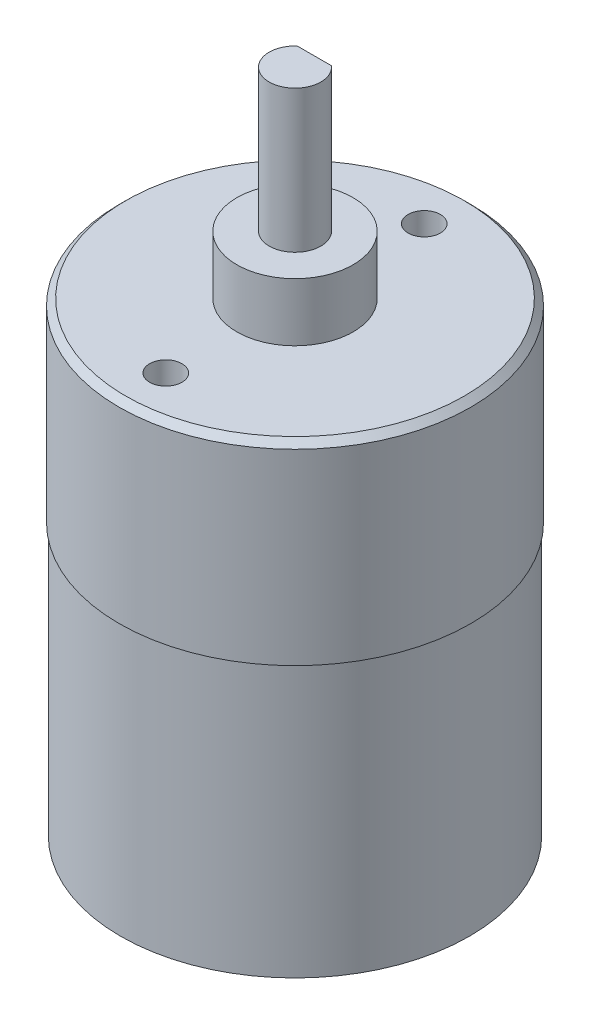
ISO-10303-21;
HEADER;
FILE_DESCRIPTION(('STEP AP214'),'2;1');
FILE_NAME('part.step','',(''),(''),'','','');
FILE_SCHEMA(('AUTOMOTIVE_DESIGN { 1 0 10303 214 1 1 1 1 }'));
ENDSEC;
DATA;
#1=APPLICATION_CONTEXT('core data for automotive mechanical design processes');
#2=APPLICATION_PROTOCOL_DEFINITION('international standard','automotive_design',2000,#1);
#3=PRODUCT_CONTEXT('',#1,'mechanical');
#4=PRODUCT('Part','Part','',(#3));
#5=PRODUCT_RELATED_PRODUCT_CATEGORY('part','',(#4));
#6=PRODUCT_DEFINITION_FORMATION('','',#4);
#7=PRODUCT_DEFINITION_CONTEXT('part definition',#1,'design');
#8=PRODUCT_DEFINITION('design','',#6,#7);
#9=PRODUCT_DEFINITION_SHAPE('','',#8);
#10=(LENGTH_UNIT() NAMED_UNIT(*) SI_UNIT(.MILLI.,.METRE.));
#11=(NAMED_UNIT(*) PLANE_ANGLE_UNIT() SI_UNIT($,.RADIAN.));
#12=(NAMED_UNIT(*) SI_UNIT($,.STERADIAN.) SOLID_ANGLE_UNIT());
#13=UNCERTAINTY_MEASURE_WITH_UNIT(LENGTH_MEASURE(1.E-05),#10,'distance_accuracy_value','');
#14=(GEOMETRIC_REPRESENTATION_CONTEXT(3) GLOBAL_UNCERTAINTY_ASSIGNED_CONTEXT((#13)) GLOBAL_UNIT_ASSIGNED_CONTEXT((#10,
#11,#12)) REPRESENTATION_CONTEXT('',''));
#15=CARTESIAN_POINT('',(0.,0.,0.));
#16=DIRECTION('',(0.,0.,1.));
#17=DIRECTION('',(1.,0.,0.));
#18=AXIS2_PLACEMENT_3D('',#15,#16,#17);
#19=CARTESIAN_POINT('',(0.,52.5,0.));
#20=DIRECTION('',(0.,1.,0.));
#21=DIRECTION('',(-1.,0.,0.));
#22=AXIS2_PLACEMENT_3D('',#19,#20,#21);
#23=CYLINDRICAL_SURFACE('',#22,4.25000000000001);
#24=CARTESIAN_POINT('',(0.,1.,0.));
#25=DIRECTION('',(0.,1.,0.));
#26=DIRECTION('',(-1.,0.,0.));
#27=AXIS2_PLACEMENT_3D('',#24,#25,#26);
#28=CIRCLE('',#27,4.25000000000001);
#29=CARTESIAN_POINT('',(-4.25000000000001,1.,0.));
#30=VERTEX_POINT('',#29);
#31=EDGE_CURVE('E178',#30,#30,#28,.T.);
#32=ORIENTED_EDGE('',*,*,#31,.F.);
#33=EDGE_LOOP('',(#32));
#34=FACE_BOUND('',#33,.T.);
#35=CARTESIAN_POINT('',(0.,0.,0.));
#36=DIRECTION('',(0.,1.,0.));
#37=DIRECTION('',(-1.,0.,0.));
#38=AXIS2_PLACEMENT_3D('',#35,#36,#37);
#39=CIRCLE('',#38,4.25000000000001);
#40=CARTESIAN_POINT('',(-4.25000000000001,0.,0.));
#41=VERTEX_POINT('',#40);
#42=EDGE_CURVE('E78',#41,#41,#39,.T.);
#43=ORIENTED_EDGE('',*,*,#42,.T.);
#44=EDGE_LOOP('',(#43));
#45=FACE_BOUND('',#44,.T.);
#46=ADVANCED_FACE('F35',(#34,#45),#23,.T.);
#47=CARTESIAN_POINT('',(4.25000000000001,0.,0.));
#48=DIRECTION('',(0.,1.,0.));
#49=DIRECTION('',(-1.,0.,0.));
#50=AXIS2_PLACEMENT_3D('',#47,#48,#49);
#51=PLANE('',#50);
#52=ORIENTED_EDGE('',*,*,#42,.F.);
#53=EDGE_LOOP('',(#52));
#54=FACE_BOUND('',#53,.T.);
#55=ADVANCED_FACE('F104',(#54),#51,.F.);
#56=CARTESIAN_POINT('',(2.,52.5,0.));
#57=DIRECTION('',(0.,-1.,0.));
#58=DIRECTION('',(1.,0.,0.));
#59=AXIS2_PLACEMENT_3D('',#56,#57,#58);
#60=PLANE('',#59);
#61=CARTESIAN_POINT('',(0.,52.5,0.));
#62=DIRECTION('',(0.,1.,0.));
#63=DIRECTION('',(-1.,0.,0.));
#64=AXIS2_PLACEMENT_3D('',#61,#62,#63);
#65=CIRCLE('',#64,2.);
#66=CARTESIAN_POINT('',(-1.3228756555323,52.5,-1.5));
#67=VERTEX_POINT('',#66);
#68=CARTESIAN_POINT('',(1.3228756555323,52.5,-1.5));
#69=VERTEX_POINT('',#68);
#70=EDGE_CURVE('E73',#67,#69,#65,.T.);
#71=ORIENTED_EDGE('',*,*,#70,.T.);
#72=DIRECTION('',(1.,0.,0.));
#73=VECTOR('',#72,1.);
#74=CARTESIAN_POINT('',(-1.3228756555323,52.5,-1.5));
#75=LINE('',#74,#73);
#76=EDGE_CURVE('E64',#67,#69,#75,.T.);
#77=ORIENTED_EDGE('',*,*,#76,.F.);
#78=EDGE_LOOP('',(#71,#77));
#79=FACE_BOUND('',#78,.T.);
#80=ADVANCED_FACE('F72',(#79),#60,.F.);
#81=CARTESIAN_POINT('',(0.,52.5,0.));
#82=DIRECTION('',(0.,1.,0.));
#83=DIRECTION('',(-1.,0.,0.));
#84=AXIS2_PLACEMENT_3D('',#81,#82,#83);
#85=CYLINDRICAL_SURFACE('',#84,2.);
#86=CARTESIAN_POINT('',(0.,44.,0.));
#87=DIRECTION('',(0.,1.,0.));
#88=DIRECTION('',(-1.,0.,0.));
#89=AXIS2_PLACEMENT_3D('',#86,#87,#88);
#90=CIRCLE('',#89,2.);
#91=CARTESIAN_POINT('',(1.3228756555323,44.,-1.5));
#92=VERTEX_POINT('',#91);
#93=CARTESIAN_POINT('',(-1.3228756555323,44.,-1.5));
#94=VERTEX_POINT('',#93);
#95=EDGE_CURVE('E54',#92,#94,#90,.T.);
#96=ORIENTED_EDGE('',*,*,#95,.F.);
#97=DIRECTION('',(0.,1.,0.));
#98=VECTOR('',#97,1.);
#99=CARTESIAN_POINT('',(1.3228756555323,44.,-1.5));
#100=LINE('',#99,#98);
#101=EDGE_CURVE('E68',#92,#69,#100,.T.);
#102=ORIENTED_EDGE('',*,*,#101,.T.);
#103=ORIENTED_EDGE('',*,*,#70,.F.);
#104=DIRECTION('',(0.,1.,0.));
#105=VECTOR('',#104,1.);
#106=CARTESIAN_POINT('',(-1.3228756555323,44.,-1.5));
#107=LINE('',#106,#105);
#108=EDGE_CURVE('E61',#94,#67,#107,.T.);
#109=ORIENTED_EDGE('',*,*,#108,.F.);
#110=EDGE_LOOP('',(#96,#102,#103,#109));
#111=FACE_BOUND('',#110,.T.);
#112=CARTESIAN_POINT('',(0.,41.5,0.));
#113=DIRECTION('',(0.,1.,0.));
#114=DIRECTION('',(-1.,0.,0.));
#115=AXIS2_PLACEMENT_3D('',#112,#113,#114);
#116=CIRCLE('',#115,2.);
#117=CARTESIAN_POINT('',(-2.,41.5,0.));
#118=VERTEX_POINT('',#117);
#119=EDGE_CURVE('E79',#118,#118,#116,.T.);
#120=ORIENTED_EDGE('',*,*,#119,.T.);
#121=EDGE_LOOP('',(#120));
#122=FACE_BOUND('',#121,.T.);
#123=ADVANCED_FACE('F76',(#111,#122),#85,.T.);
#124=CARTESIAN_POINT('',(4.5,41.5,0.));
#125=DIRECTION('',(0.,-1.,0.));
#126=DIRECTION('',(1.,0.,0.));
#127=AXIS2_PLACEMENT_3D('',#124,#125,#126);
#128=PLANE('',#127);
#129=ORIENTED_EDGE('',*,*,#119,.F.);
#130=EDGE_LOOP('',(#129));
#131=FACE_BOUND('',#130,.T.);
#132=CARTESIAN_POINT('',(0.,41.5,0.));
#133=DIRECTION('',(0.,1.,0.));
#134=DIRECTION('',(-1.,0.,0.));
#135=AXIS2_PLACEMENT_3D('',#132,#133,#134);
#136=CIRCLE('',#135,4.5);
#137=CARTESIAN_POINT('',(-4.5,41.5,0.));
#138=VERTEX_POINT('',#137);
#139=EDGE_CURVE('E84',#138,#138,#136,.T.);
#140=ORIENTED_EDGE('',*,*,#139,.T.);
#141=EDGE_LOOP('',(#140));
#142=FACE_BOUND('',#141,.T.);
#143=ADVANCED_FACE('F118',(#131,#142),#128,.F.);
#144=CARTESIAN_POINT('',(0.,52.5,0.));
#145=DIRECTION('',(0.,1.,0.));
#146=DIRECTION('',(-1.,0.,0.));
#147=AXIS2_PLACEMENT_3D('',#144,#145,#146);
#148=CYLINDRICAL_SURFACE('',#147,4.5);
#149=ORIENTED_EDGE('',*,*,#139,.F.);
#150=EDGE_LOOP('',(#149));
#151=FACE_BOUND('',#150,.T.);
#152=CARTESIAN_POINT('',(0.,37.,0.));
#153=DIRECTION('',(0.,1.,0.));
#154=DIRECTION('',(-1.,0.,0.));
#155=AXIS2_PLACEMENT_3D('',#152,#153,#154);
#156=CIRCLE('',#155,4.5);
#157=CARTESIAN_POINT('',(-4.5,37.,0.));
#158=VERTEX_POINT('',#157);
#159=EDGE_CURVE('E191',#158,#158,#156,.T.);
#160=ORIENTED_EDGE('',*,*,#159,.T.);
#161=EDGE_LOOP('',(#160));
#162=FACE_BOUND('',#161,.T.);
#163=ADVANCED_FACE('F121',(#151,#162),#148,.T.);
#164=CARTESIAN_POINT('',(13.6,37.,0.));
#165=DIRECTION('',(0.,-1.,0.));
#166=DIRECTION('',(1.,0.,0.));
#167=AXIS2_PLACEMENT_3D('',#164,#165,#166);
#168=PLANE('',#167);
#169=CARTESIAN_POINT('',(0.,37.,0.));
#170=DIRECTION('',(0.,-1.,0.));
#171=DIRECTION('',(1.,0.,0.));
#172=AXIS2_PLACEMENT_3D('',#169,#170,#171);
#173=CIRCLE('',#172,13.1);
#174=CARTESIAN_POINT('',(13.1,37.,0.));
#175=VERTEX_POINT('',#174);
#176=EDGE_CURVE('E43',#175,#175,#173,.F.);
#177=ORIENTED_EDGE('',*,*,#176,.T.);
#178=EDGE_LOOP('',(#177));
#179=FACE_BOUND('',#178,.T.);
#180=CARTESIAN_POINT('',(0.,37.,10.));
#181=DIRECTION('',(0.,1.,0.));
#182=DIRECTION('',(1.,0.,0.));
#183=AXIS2_PLACEMENT_3D('',#180,#181,#182);
#184=CIRCLE('',#183,1.25);
#185=CARTESIAN_POINT('',(1.25,37.,10.));
#186=VERTEX_POINT('',#185);
#187=EDGE_CURVE('E167',#186,#186,#184,.T.);
#188=ORIENTED_EDGE('',*,*,#187,.F.);
#189=EDGE_LOOP('',(#188));
#190=FACE_BOUND('',#189,.T.);
#191=CARTESIAN_POINT('',(0.,37.,-10.));
#192=DIRECTION('',(0.,1.,0.));
#193=DIRECTION('',(-1.,0.,0.));
#194=AXIS2_PLACEMENT_3D('',#191,#192,#193);
#195=CIRCLE('',#194,1.25);
#196=CARTESIAN_POINT('',(-1.25,37.,-10.));
#197=VERTEX_POINT('',#196);
#198=EDGE_CURVE('E169',#197,#197,#195,.T.);
#199=ORIENTED_EDGE('',*,*,#198,.F.);
#200=EDGE_LOOP('',(#199));
#201=FACE_BOUND('',#200,.T.);
#202=ORIENTED_EDGE('',*,*,#159,.F.);
#203=EDGE_LOOP('',(#202));
#204=FACE_BOUND('',#203,.T.);
#205=ADVANCED_FACE('F90',(#179,#190,#201,#204),#168,.F.);
#206=CARTESIAN_POINT('',(0.,52.5,0.));
#207=DIRECTION('',(0.,1.,0.));
#208=DIRECTION('',(-1.,0.,0.));
#209=AXIS2_PLACEMENT_3D('',#206,#207,#208);
#210=CYLINDRICAL_SURFACE('',#209,13.6);
#211=CARTESIAN_POINT('',(0.,36.5,0.));
#212=DIRECTION('',(0.,-1.,0.));
#213=DIRECTION('',(1.,0.,0.));
#214=AXIS2_PLACEMENT_3D('',#211,#212,#213);
#215=CIRCLE('',#214,13.6);
#216=CARTESIAN_POINT('',(13.6,36.5,0.));
#217=VERTEX_POINT('',#216);
#218=EDGE_CURVE('E11',#217,#217,#215,.T.);
#219=ORIENTED_EDGE('',*,*,#218,.T.);
#220=EDGE_LOOP('',(#219));
#221=FACE_BOUND('',#220,.T.);
#222=CARTESIAN_POINT('',(0.,22.,0.));
#223=DIRECTION('',(0.,1.,0.));
#224=DIRECTION('',(-1.,0.,0.));
#225=AXIS2_PLACEMENT_3D('',#222,#223,#224);
#226=CIRCLE('',#225,13.6);
#227=CARTESIAN_POINT('',(-13.6,22.,0.));
#228=VERTEX_POINT('',#227);
#229=EDGE_CURVE('E188',#228,#228,#226,.T.);
#230=ORIENTED_EDGE('',*,*,#229,.T.);
#231=EDGE_LOOP('',(#230));
#232=FACE_BOUND('',#231,.T.);
#233=ADVANCED_FACE('F128',(#221,#232),#210,.T.);
#234=CARTESIAN_POINT('',(13.5,22.,0.));
#235=DIRECTION('',(0.,1.,0.));
#236=DIRECTION('',(-1.,0.,0.));
#237=AXIS2_PLACEMENT_3D('',#234,#235,#236);
#238=PLANE('',#237);
#239=ORIENTED_EDGE('',*,*,#229,.F.);
#240=EDGE_LOOP('',(#239));
#241=FACE_BOUND('',#240,.T.);
#242=CARTESIAN_POINT('',(0.,22.,0.));
#243=DIRECTION('',(0.,1.,0.));
#244=DIRECTION('',(-1.,0.,0.));
#245=AXIS2_PLACEMENT_3D('',#242,#243,#244);
#246=CIRCLE('',#245,13.5);
#247=CARTESIAN_POINT('',(-13.5,22.,0.));
#248=VERTEX_POINT('',#247);
#249=EDGE_CURVE('E185',#248,#248,#246,.T.);
#250=ORIENTED_EDGE('',*,*,#249,.T.);
#251=EDGE_LOOP('',(#250));
#252=FACE_BOUND('',#251,.T.);
#253=ADVANCED_FACE('F131',(#241,#252),#238,.F.);
#254=CARTESIAN_POINT('',(0.,52.5,0.));
#255=DIRECTION('',(0.,1.,0.));
#256=DIRECTION('',(-1.,0.,0.));
#257=AXIS2_PLACEMENT_3D('',#254,#255,#256);
#258=CYLINDRICAL_SURFACE('',#257,13.5);
#259=ORIENTED_EDGE('',*,*,#249,.F.);
#260=EDGE_LOOP('',(#259));
#261=FACE_BOUND('',#260,.T.);
#262=CARTESIAN_POINT('',(0.,1.,0.));
#263=DIRECTION('',(0.,1.,0.));
#264=DIRECTION('',(-1.,0.,0.));
#265=AXIS2_PLACEMENT_3D('',#262,#263,#264);
#266=CIRCLE('',#265,13.5);
#267=CARTESIAN_POINT('',(-13.5,1.,0.));
#268=VERTEX_POINT('',#267);
#269=EDGE_CURVE('E182',#268,#268,#266,.T.);
#270=ORIENTED_EDGE('',*,*,#269,.T.);
#271=EDGE_LOOP('',(#270));
#272=FACE_BOUND('',#271,.T.);
#273=ADVANCED_FACE('F135',(#261,#272),#258,.T.);
#274=CARTESIAN_POINT('',(4.25000000000001,1.,0.));
#275=DIRECTION('',(0.,1.,0.));
#276=DIRECTION('',(-1.,0.,0.));
#277=AXIS2_PLACEMENT_3D('',#274,#275,#276);
#278=PLANE('',#277);
#279=ORIENTED_EDGE('',*,*,#269,.F.);
#280=EDGE_LOOP('',(#279));
#281=FACE_BOUND('',#280,.T.);
#282=ORIENTED_EDGE('',*,*,#31,.T.);
#283=EDGE_LOOP('',(#282));
#284=FACE_BOUND('',#283,.T.);
#285=ADVANCED_FACE('F139',(#281,#284),#278,.F.);
#286=CARTESIAN_POINT('',(-1.3228756555323,44.,-1.5));
#287=DIRECTION('',(0.,0.,1.));
#288=DIRECTION('',(1.,0.,0.));
#289=AXIS2_PLACEMENT_3D('',#286,#287,#288);
#290=PLANE('',#289);
#291=ORIENTED_EDGE('',*,*,#76,.T.);
#292=ORIENTED_EDGE('',*,*,#101,.F.);
#293=DIRECTION('',(1.,0.,0.));
#294=VECTOR('',#293,1.);
#295=CARTESIAN_POINT('',(-1.3228756555323,44.,-1.5));
#296=LINE('',#295,#294);
#297=EDGE_CURVE('E49',#94,#92,#296,.T.);
#298=ORIENTED_EDGE('',*,*,#297,.F.);
#299=ORIENTED_EDGE('',*,*,#108,.T.);
#300=EDGE_LOOP('',(#291,#292,#298,#299));
#301=FACE_BOUND('',#300,.T.);
#302=ADVANCED_FACE('F63',(#301),#290,.F.);
#303=CARTESIAN_POINT('',(0.,44.,0.));
#304=DIRECTION('',(0.,1.,0.));
#305=DIRECTION('',(-1.,0.,0.));
#306=AXIS2_PLACEMENT_3D('',#303,#304,#305);
#307=PLANE('',#306);
#308=ORIENTED_EDGE('',*,*,#95,.T.);
#309=ORIENTED_EDGE('',*,*,#297,.T.);
#310=EDGE_LOOP('',(#308,#309));
#311=FACE_BOUND('',#310,.T.);
#312=ADVANCED_FACE('F146',(#311),#307,.T.);
#313=CARTESIAN_POINT('',(0.,33.,-10.));
#314=DIRECTION('',(0.,1.,0.));
#315=DIRECTION('',(-1.,0.,0.));
#316=AXIS2_PLACEMENT_3D('',#313,#314,#315);
#317=CYLINDRICAL_SURFACE('',#316,1.25);
#318=CARTESIAN_POINT('',(0.,33.,-10.));
#319=DIRECTION('',(0.,1.,0.));
#320=DIRECTION('',(-1.,0.,0.));
#321=AXIS2_PLACEMENT_3D('',#318,#319,#320);
#322=CIRCLE('',#321,1.25);
#323=CARTESIAN_POINT('',(-1.25,33.,-10.));
#324=VERTEX_POINT('',#323);
#325=EDGE_CURVE('E74',#324,#324,#322,.T.);
#326=ORIENTED_EDGE('',*,*,#325,.F.);
#327=EDGE_LOOP('',(#326));
#328=FACE_BOUND('',#327,.T.);
#329=ORIENTED_EDGE('',*,*,#198,.T.);
#330=EDGE_LOOP('',(#329));
#331=FACE_BOUND('',#330,.T.);
#332=ADVANCED_FACE('F149',(#328,#331),#317,.F.);
#333=CARTESIAN_POINT('',(0.,33.,-10.));
#334=DIRECTION('',(0.,1.,0.));
#335=DIRECTION('',(-1.,0.,0.));
#336=AXIS2_PLACEMENT_3D('',#333,#334,#335);
#337=PLANE('',#336);
#338=ORIENTED_EDGE('',*,*,#325,.T.);
#339=EDGE_LOOP('',(#338));
#340=FACE_BOUND('',#339,.T.);
#341=ADVANCED_FACE('F152',(#340),#337,.T.);
#342=CARTESIAN_POINT('',(0.,33.,10.));
#343=DIRECTION('',(0.,1.,0.));
#344=DIRECTION('',(-1.,0.,0.));
#345=AXIS2_PLACEMENT_3D('',#342,#343,#344);
#346=CYLINDRICAL_SURFACE('',#345,1.25);
#347=CARTESIAN_POINT('',(0.,33.,10.));
#348=DIRECTION('',(0.,1.,0.));
#349=DIRECTION('',(1.,0.,0.));
#350=AXIS2_PLACEMENT_3D('',#347,#348,#349);
#351=CIRCLE('',#350,1.25);
#352=CARTESIAN_POINT('',(1.25,33.,10.));
#353=VERTEX_POINT('',#352);
#354=EDGE_CURVE('E164',#353,#353,#351,.T.);
#355=ORIENTED_EDGE('',*,*,#354,.F.);
#356=EDGE_LOOP('',(#355));
#357=FACE_BOUND('',#356,.T.);
#358=ORIENTED_EDGE('',*,*,#187,.T.);
#359=EDGE_LOOP('',(#358));
#360=FACE_BOUND('',#359,.T.);
#361=ADVANCED_FACE('F99',(#357,#360),#346,.F.);
#362=CARTESIAN_POINT('',(0.,33.,10.));
#363=DIRECTION('',(0.,-1.,0.));
#364=DIRECTION('',(1.,0.,0.));
#365=AXIS2_PLACEMENT_3D('',#362,#363,#364);
#366=PLANE('',#365);
#367=ORIENTED_EDGE('',*,*,#354,.T.);
#368=EDGE_LOOP('',(#367));
#369=FACE_BOUND('',#368,.T.);
#370=ADVANCED_FACE('F94',(#369),#366,.F.);
#371=CARTESIAN_POINT('',(0.,37.,0.));
#372=DIRECTION('',(0.,-1.,0.));
#373=DIRECTION('',(1.,0.,0.));
#374=AXIS2_PLACEMENT_3D('',#371,#372,#373);
#375=CONICAL_SURFACE('',#374,13.1,0.785398163397443);
#376=ORIENTED_EDGE('',*,*,#218,.F.);
#377=EDGE_LOOP('',(#376));
#378=FACE_BOUND('',#377,.T.);
#379=ORIENTED_EDGE('',*,*,#176,.F.);
#380=EDGE_LOOP('',(#379));
#381=FACE_BOUND('',#380,.T.);
#382=ADVANCED_FACE('F37',(#378,#381),#375,.T.);
#383=CLOSED_SHELL('',(#46,#55,#80,#123,#143,#163,#205,#233,#253,#273,#285,#302,#312,#332,#341,
#361,#370,#382));
#384=MANIFOLD_SOLID_BREP('B2',#383);
#385=ADVANCED_BREP_SHAPE_REPRESENTATION('',(#18,#384),#14);
#386=SHAPE_DEFINITION_REPRESENTATION(#9,#385);
ENDSEC;
END-ISO-10303-21;
